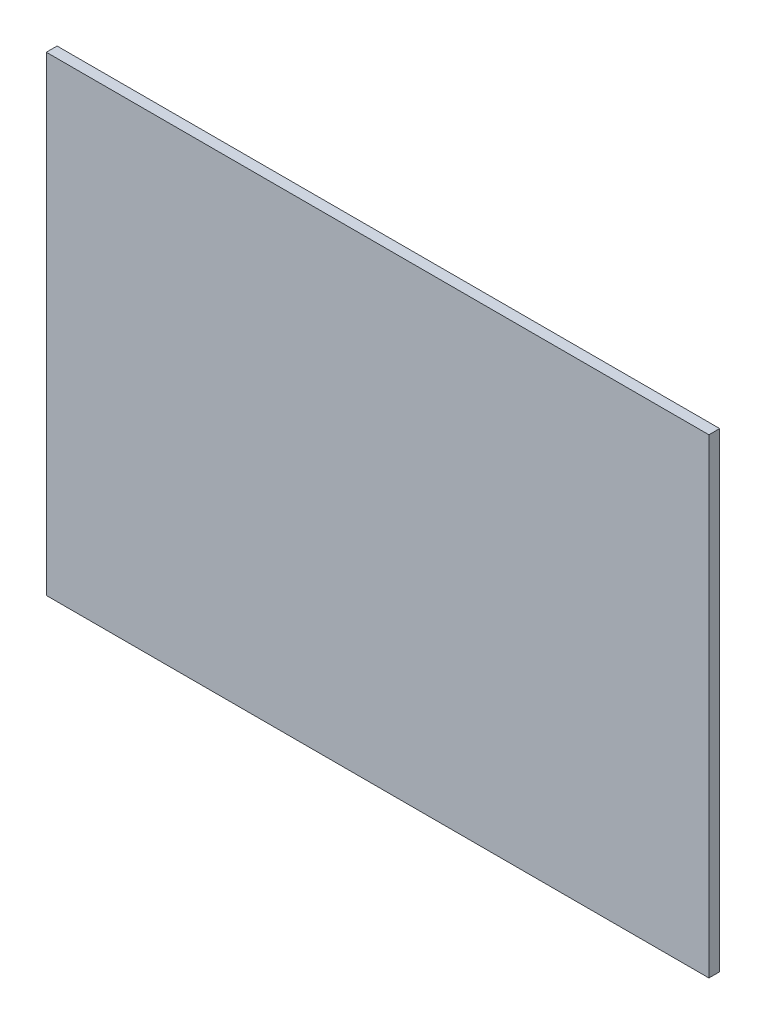
ISO-10303-21;
HEADER;
FILE_DESCRIPTION(('STEP AP214'),'2;1');
FILE_NAME('part.step','',(''),(''),'','','');
FILE_SCHEMA(('AUTOMOTIVE_DESIGN { 1 0 10303 214 1 1 1 1 }'));
ENDSEC;
DATA;
#1=APPLICATION_CONTEXT('core data for automotive mechanical design processes');
#2=APPLICATION_PROTOCOL_DEFINITION('international standard','automotive_design',2000,#1);
#3=PRODUCT_CONTEXT('',#1,'mechanical');
#4=PRODUCT('Part','Part','',(#3));
#5=PRODUCT_RELATED_PRODUCT_CATEGORY('part','',(#4));
#6=PRODUCT_DEFINITION_FORMATION('','',#4);
#7=PRODUCT_DEFINITION_CONTEXT('part definition',#1,'design');
#8=PRODUCT_DEFINITION('design','',#6,#7);
#9=PRODUCT_DEFINITION_SHAPE('','',#8);
#10=(LENGTH_UNIT() NAMED_UNIT(*) SI_UNIT(.MILLI.,.METRE.));
#11=(NAMED_UNIT(*) PLANE_ANGLE_UNIT() SI_UNIT($,.RADIAN.));
#12=(NAMED_UNIT(*) SI_UNIT($,.STERADIAN.) SOLID_ANGLE_UNIT());
#13=UNCERTAINTY_MEASURE_WITH_UNIT(LENGTH_MEASURE(1.E-05),#10,'distance_accuracy_value','');
#14=(GEOMETRIC_REPRESENTATION_CONTEXT(3) GLOBAL_UNCERTAINTY_ASSIGNED_CONTEXT((#13)) GLOBAL_UNIT_ASSIGNED_CONTEXT((#10,
#11,#12)) REPRESENTATION_CONTEXT('',''));
#15=CARTESIAN_POINT('',(0.,0.,0.));
#16=DIRECTION('',(0.,0.,1.));
#17=DIRECTION('',(1.,0.,0.));
#18=AXIS2_PLACEMENT_3D('',#15,#16,#17);
#19=CARTESIAN_POINT('',(115.500000000004,310.,6.));
#20=DIRECTION('',(1.,0.,0.));
#21=DIRECTION('',(0.,1.,0.));
#22=AXIS2_PLACEMENT_3D('',#19,#20,#21);
#23=PLANE('',#22);
#24=DIRECTION('',(0.,-1.,0.));
#25=VECTOR('',#24,1.);
#26=CARTESIAN_POINT('',(115.500000000004,310.,0.));
#27=LINE('',#26,#25);
#28=CARTESIAN_POINT('',(115.500000000004,310.,0.));
#29=VERTEX_POINT('',#28);
#30=CARTESIAN_POINT('',(115.500000000004,48.0000000000001,0.));
#31=VERTEX_POINT('',#30);
#32=EDGE_CURVE('E96',#29,#31,#27,.T.);
#33=ORIENTED_EDGE('',*,*,#32,.T.);
#34=DIRECTION('',(0.,0.,-1.));
#35=VECTOR('',#34,1.);
#36=CARTESIAN_POINT('',(115.500000000004,48.0000000000001,6.));
#37=LINE('',#36,#35);
#38=CARTESIAN_POINT('',(115.500000000004,48.0000000000001,6.));
#39=VERTEX_POINT('',#38);
#40=EDGE_CURVE('E11',#39,#31,#37,.T.);
#41=ORIENTED_EDGE('',*,*,#40,.F.);
#42=DIRECTION('',(0.,-1.,0.));
#43=VECTOR('',#42,1.);
#44=CARTESIAN_POINT('',(115.500000000004,310.,6.));
#45=LINE('',#44,#43);
#46=CARTESIAN_POINT('',(115.500000000004,310.,6.));
#47=VERTEX_POINT('',#46);
#48=EDGE_CURVE('E84',#47,#39,#45,.T.);
#49=ORIENTED_EDGE('',*,*,#48,.F.);
#50=DIRECTION('',(0.,0.,-1.));
#51=VECTOR('',#50,1.);
#52=CARTESIAN_POINT('',(115.500000000004,310.,6.));
#53=LINE('',#52,#51);
#54=EDGE_CURVE('E92',#47,#29,#53,.T.);
#55=ORIENTED_EDGE('',*,*,#54,.T.);
#56=EDGE_LOOP('',(#33,#41,#49,#55));
#57=FACE_BOUND('',#56,.T.);
#58=ADVANCED_FACE('F33',(#57),#23,.F.);
#59=CARTESIAN_POINT('',(115.500000000004,48.0000000000001,6.));
#60=DIRECTION('',(0.,1.,0.));
#61=DIRECTION('',(0.,0.,1.));
#62=AXIS2_PLACEMENT_3D('',#59,#60,#61);
#63=PLANE('',#62);
#64=DIRECTION('',(1.,0.,0.));
#65=VECTOR('',#64,1.);
#66=CARTESIAN_POINT('',(115.500000000004,48.0000000000001,0.));
#67=LINE('',#66,#65);
#68=CARTESIAN_POINT('',(484.500000000004,48.0000000000001,0.));
#69=VERTEX_POINT('',#68);
#70=EDGE_CURVE('E88',#31,#69,#67,.T.);
#71=ORIENTED_EDGE('',*,*,#70,.T.);
#72=DIRECTION('',(0.,0.,-1.));
#73=VECTOR('',#72,1.);
#74=CARTESIAN_POINT('',(484.500000000004,48.0000000000001,6.));
#75=LINE('',#74,#73);
#76=CARTESIAN_POINT('',(484.500000000004,48.0000000000001,6.));
#77=VERTEX_POINT('',#76);
#78=EDGE_CURVE('E41',#77,#69,#75,.T.);
#79=ORIENTED_EDGE('',*,*,#78,.F.);
#80=DIRECTION('',(1.,0.,0.));
#81=VECTOR('',#80,1.);
#82=CARTESIAN_POINT('',(115.500000000004,48.0000000000001,6.));
#83=LINE('',#82,#81);
#84=EDGE_CURVE('E79',#39,#77,#83,.T.);
#85=ORIENTED_EDGE('',*,*,#84,.F.);
#86=ORIENTED_EDGE('',*,*,#40,.T.);
#87=EDGE_LOOP('',(#71,#79,#85,#86));
#88=FACE_BOUND('',#87,.T.);
#89=ADVANCED_FACE('F87',(#88),#63,.F.);
#90=CARTESIAN_POINT('',(484.500000000004,310.,6.));
#91=DIRECTION('',(-1.,0.,0.));
#92=DIRECTION('',(0.,-1.,0.));
#93=AXIS2_PLACEMENT_3D('',#90,#91,#92);
#94=PLANE('',#93);
#95=DIRECTION('',(0.,1.,0.));
#96=VECTOR('',#95,1.);
#97=CARTESIAN_POINT('',(484.500000000004,310.,0.));
#98=LINE('',#97,#96);
#99=CARTESIAN_POINT('',(484.500000000004,310.,0.));
#100=VERTEX_POINT('',#99);
#101=EDGE_CURVE('E66',#69,#100,#98,.T.);
#102=ORIENTED_EDGE('',*,*,#101,.T.);
#103=DIRECTION('',(0.,0.,-1.));
#104=VECTOR('',#103,1.);
#105=CARTESIAN_POINT('',(484.500000000004,310.,6.));
#106=LINE('',#105,#104);
#107=CARTESIAN_POINT('',(484.500000000004,310.,6.));
#108=VERTEX_POINT('',#107);
#109=EDGE_CURVE('E89',#108,#100,#106,.T.);
#110=ORIENTED_EDGE('',*,*,#109,.F.);
#111=DIRECTION('',(0.,1.,0.));
#112=VECTOR('',#111,1.);
#113=CARTESIAN_POINT('',(484.500000000004,310.,6.));
#114=LINE('',#113,#112);
#115=EDGE_CURVE('E82',#77,#108,#114,.T.);
#116=ORIENTED_EDGE('',*,*,#115,.F.);
#117=ORIENTED_EDGE('',*,*,#78,.T.);
#118=EDGE_LOOP('',(#102,#110,#116,#117));
#119=FACE_BOUND('',#118,.T.);
#120=ADVANCED_FACE('F90',(#119),#94,.F.);
#121=CARTESIAN_POINT('',(115.500000000004,310.,6.));
#122=DIRECTION('',(0.,-1.,0.));
#123=DIRECTION('',(0.,0.,-1.));
#124=AXIS2_PLACEMENT_3D('',#121,#122,#123);
#125=PLANE('',#124);
#126=DIRECTION('',(-1.,0.,0.));
#127=VECTOR('',#126,1.);
#128=CARTESIAN_POINT('',(115.500000000004,310.,0.));
#129=LINE('',#128,#127);
#130=EDGE_CURVE('E72',#100,#29,#129,.T.);
#131=ORIENTED_EDGE('',*,*,#130,.T.);
#132=ORIENTED_EDGE('',*,*,#54,.F.);
#133=DIRECTION('',(-1.,0.,0.));
#134=VECTOR('',#133,1.);
#135=CARTESIAN_POINT('',(115.500000000004,310.,6.));
#136=LINE('',#135,#134);
#137=EDGE_CURVE('E49',#108,#47,#136,.T.);
#138=ORIENTED_EDGE('',*,*,#137,.F.);
#139=ORIENTED_EDGE('',*,*,#109,.T.);
#140=EDGE_LOOP('',(#131,#132,#138,#139));
#141=FACE_BOUND('',#140,.T.);
#142=ADVANCED_FACE('F103',(#141),#125,.F.);
#143=CARTESIAN_POINT('',(0.,0.,6.));
#144=DIRECTION('',(0.,0.,1.));
#145=DIRECTION('',(1.,0.,0.));
#146=AXIS2_PLACEMENT_3D('',#143,#144,#145);
#147=PLANE('',#146);
#148=ORIENTED_EDGE('',*,*,#48,.T.);
#149=ORIENTED_EDGE('',*,*,#84,.T.);
#150=ORIENTED_EDGE('',*,*,#115,.T.);
#151=ORIENTED_EDGE('',*,*,#137,.T.);
#152=EDGE_LOOP('',(#148,#149,#150,#151));
#153=FACE_BOUND('',#152,.T.);
#154=ADVANCED_FACE('F80',(#153),#147,.T.);
#155=CARTESIAN_POINT('',(0.,0.,0.));
#156=DIRECTION('',(0.,0.,1.));
#157=DIRECTION('',(1.,0.,0.));
#158=AXIS2_PLACEMENT_3D('',#155,#156,#157);
#159=PLANE('',#158);
#160=ORIENTED_EDGE('',*,*,#32,.F.);
#161=ORIENTED_EDGE('',*,*,#130,.F.);
#162=ORIENTED_EDGE('',*,*,#101,.F.);
#163=ORIENTED_EDGE('',*,*,#70,.F.);
#164=EDGE_LOOP('',(#160,#161,#162,#163));
#165=FACE_BOUND('',#164,.T.);
#166=ADVANCED_FACE('F106',(#165),#159,.F.);
#167=CLOSED_SHELL('',(#58,#89,#120,#142,#154,#166));
#168=MANIFOLD_SOLID_BREP('B2',#167);
#169=ADVANCED_BREP_SHAPE_REPRESENTATION('',(#18,#168),#14);
#170=SHAPE_DEFINITION_REPRESENTATION(#9,#169);
ENDSEC;
END-ISO-10303-21;
